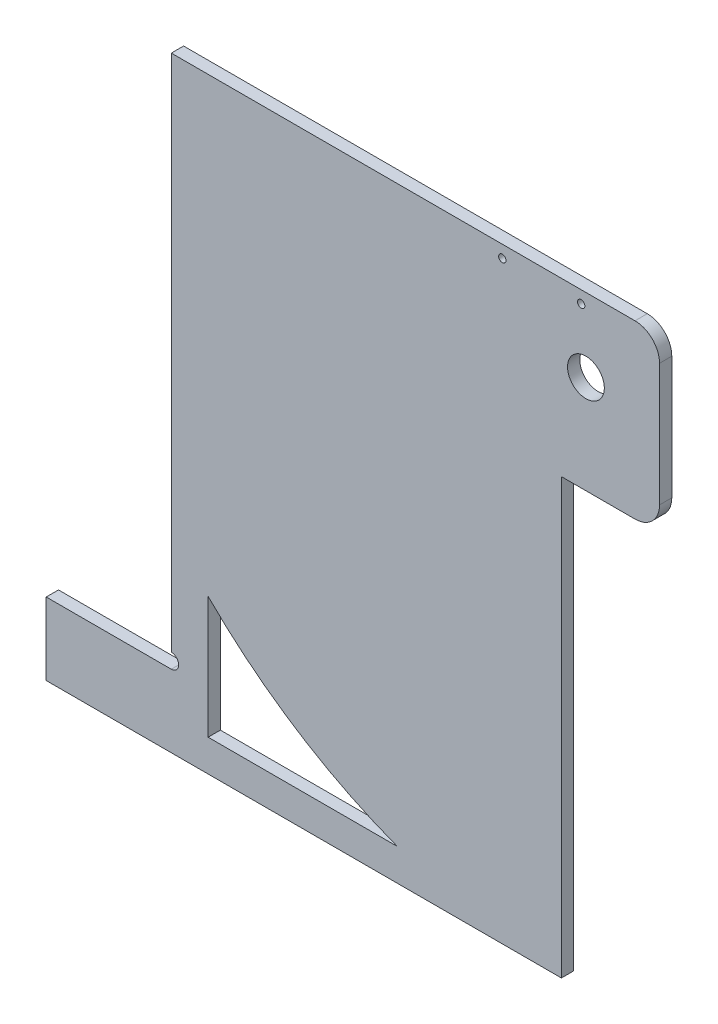
ISO-10303-21;
HEADER;
FILE_DESCRIPTION(('STEP AP214'),'2;1');
FILE_NAME('part.step','',(''),(''),'','','');
FILE_SCHEMA(('AUTOMOTIVE_DESIGN { 1 0 10303 214 1 1 1 1 }'));
ENDSEC;
DATA;
#1=APPLICATION_CONTEXT('core data for automotive mechanical design processes');
#2=APPLICATION_PROTOCOL_DEFINITION('international standard','automotive_design',2000,#1);
#3=PRODUCT_CONTEXT('',#1,'mechanical');
#4=PRODUCT('Part','Part','',(#3));
#5=PRODUCT_RELATED_PRODUCT_CATEGORY('part','',(#4));
#6=PRODUCT_DEFINITION_FORMATION('','',#4);
#7=PRODUCT_DEFINITION_CONTEXT('part definition',#1,'design');
#8=PRODUCT_DEFINITION('design','',#6,#7);
#9=PRODUCT_DEFINITION_SHAPE('','',#8);
#10=(LENGTH_UNIT() NAMED_UNIT(*) SI_UNIT(.MILLI.,.METRE.));
#11=(NAMED_UNIT(*) PLANE_ANGLE_UNIT() SI_UNIT($,.RADIAN.));
#12=(NAMED_UNIT(*) SI_UNIT($,.STERADIAN.) SOLID_ANGLE_UNIT());
#13=UNCERTAINTY_MEASURE_WITH_UNIT(LENGTH_MEASURE(1.E-05),#10,'distance_accuracy_value','');
#14=(GEOMETRIC_REPRESENTATION_CONTEXT(3) GLOBAL_UNCERTAINTY_ASSIGNED_CONTEXT((#13)) GLOBAL_UNIT_ASSIGNED_CONTEXT((#10,
#11,#12)) REPRESENTATION_CONTEXT('',''));
#15=CARTESIAN_POINT('',(0.,0.,0.));
#16=DIRECTION('',(0.,0.,1.));
#17=DIRECTION('',(1.,0.,0.));
#18=AXIS2_PLACEMENT_3D('',#15,#16,#17);
#19=CARTESIAN_POINT('',(10.,-10.,5.));
#20=DIRECTION('',(0.,0.,1.));
#21=DIRECTION('',(1.,0.,0.));
#22=AXIS2_PLACEMENT_3D('',#19,#20,#21);
#23=PLANE('',#22);
#24=DIRECTION('',(0.,1.,0.));
#25=VECTOR('',#24,1.);
#26=CARTESIAN_POINT('',(51.,-217.5,5.));
#27=LINE('',#26,#25);
#28=CARTESIAN_POINT('',(51.,-211.5,5.));
#29=VERTEX_POINT('',#28);
#30=CARTESIAN_POINT('',(51.,0.,5.));
#31=VERTEX_POINT('',#30);
#32=EDGE_CURVE('E213',#29,#31,#27,.T.);
#33=ORIENTED_EDGE('',*,*,#32,.F.);
#34=CARTESIAN_POINT('',(51.,-214.5,5.));
#35=DIRECTION('',(0.,0.,1.));
#36=DIRECTION('',(1.,0.,0.));
#37=AXIS2_PLACEMENT_3D('',#34,#35,#36);
#38=CIRCLE('',#37,3.);
#39=CARTESIAN_POINT('',(51.,-217.5,5.));
#40=VERTEX_POINT('',#39);
#41=EDGE_CURVE('E232',#40,#29,#38,.T.);
#42=ORIENTED_EDGE('',*,*,#41,.F.);
#43=DIRECTION('',(-1.,0.,0.));
#44=VECTOR('',#43,1.);
#45=CARTESIAN_POINT('',(51.,-217.5,5.));
#46=LINE('',#45,#44);
#47=CARTESIAN_POINT('',(0.,-217.5,5.));
#48=VERTEX_POINT('',#47);
#49=EDGE_CURVE('E243',#40,#48,#46,.T.);
#50=ORIENTED_EDGE('',*,*,#49,.T.);
#51=DIRECTION('',(0.,-1.,0.));
#52=VECTOR('',#51,1.);
#53=CARTESIAN_POINT('',(0.,-237.,5.));
#54=LINE('',#53,#52);
#55=CARTESIAN_POINT('',(0.,-247.,5.));
#56=VERTEX_POINT('',#55);
#57=EDGE_CURVE('E257',#48,#56,#54,.T.);
#58=ORIENTED_EDGE('',*,*,#57,.T.);
#59=DIRECTION('',(-1.,0.,0.));
#60=VECTOR('',#59,1.);
#61=CARTESIAN_POINT('',(10.0000000000001,-247.,5.));
#62=LINE('',#61,#60);
#63=CARTESIAN_POINT('',(210.,-247.,5.));
#64=VERTEX_POINT('',#63);
#65=EDGE_CURVE('E254',#64,#56,#62,.T.);
#66=ORIENTED_EDGE('',*,*,#65,.F.);
#67=DIRECTION('',(0.,-1.,0.));
#68=VECTOR('',#67,1.);
#69=CARTESIAN_POINT('',(210.,0.,5.));
#70=LINE('',#69,#68);
#71=CARTESIAN_POINT('',(210.,-70.,5.));
#72=VERTEX_POINT('',#71);
#73=EDGE_CURVE('E262',#72,#64,#70,.T.);
#74=ORIENTED_EDGE('',*,*,#73,.F.);
#75=DIRECTION('',(1.,0.,0.));
#76=VECTOR('',#75,1.);
#77=CARTESIAN_POINT('',(210.,-70.,5.));
#78=LINE('',#77,#76);
#79=CARTESIAN_POINT('',(240.,-70.,5.));
#80=VERTEX_POINT('',#79);
#81=EDGE_CURVE('E287',#72,#80,#78,.T.);
#82=ORIENTED_EDGE('',*,*,#81,.T.);
#83=CARTESIAN_POINT('',(240.,-60.,5.));
#84=DIRECTION('',(0.,0.,1.));
#85=DIRECTION('',(1.,0.,0.));
#86=AXIS2_PLACEMENT_3D('',#83,#84,#85);
#87=CIRCLE('',#86,10.);
#88=CARTESIAN_POINT('',(250.,-60.,5.));
#89=VERTEX_POINT('',#88);
#90=EDGE_CURVE('E285',#80,#89,#87,.T.);
#91=ORIENTED_EDGE('',*,*,#90,.T.);
#92=DIRECTION('',(0.,-1.,0.));
#93=VECTOR('',#92,1.);
#94=CARTESIAN_POINT('',(250.,-10.0000000000001,5.));
#95=LINE('',#94,#93);
#96=CARTESIAN_POINT('',(250.,-10.0000000000001,5.));
#97=VERTEX_POINT('',#96);
#98=EDGE_CURVE('E281',#97,#89,#95,.T.);
#99=ORIENTED_EDGE('',*,*,#98,.F.);
#100=CARTESIAN_POINT('',(240.,-10.,5.));
#101=DIRECTION('',(0.,0.,-1.));
#102=DIRECTION('',(-1.,0.,0.));
#103=AXIS2_PLACEMENT_3D('',#100,#101,#102);
#104=CIRCLE('',#103,10.);
#105=CARTESIAN_POINT('',(240.,0.,5.));
#106=VERTEX_POINT('',#105);
#107=EDGE_CURVE('E278',#106,#97,#104,.T.);
#108=ORIENTED_EDGE('',*,*,#107,.F.);
#109=DIRECTION('',(1.,0.,0.));
#110=VECTOR('',#109,1.);
#111=CARTESIAN_POINT('',(10.0000000000001,0.,5.));
#112=LINE('',#111,#110);
#113=EDGE_CURVE('E260',#31,#106,#112,.T.);
#114=ORIENTED_EDGE('',*,*,#113,.F.);
#115=EDGE_LOOP('',(#33,#42,#50,#58,#66,#74,#82,#91,#99,#108,#114));
#116=FACE_BOUND('',#115,.T.);
#117=CARTESIAN_POINT('',(218.076993273607,-5.00000000000004,5.));
#118=DIRECTION('',(0.,0.,1.));
#119=DIRECTION('',(1.,0.,0.));
#120=AXIS2_PLACEMENT_3D('',#117,#118,#119);
#121=CIRCLE('',#120,1.5);
#122=CARTESIAN_POINT('',(219.576993273607,-5.00000000000004,5.));
#123=VERTEX_POINT('',#122);
#124=EDGE_CURVE('E219',#123,#123,#121,.T.);
#125=ORIENTED_EDGE('',*,*,#124,.F.);
#126=EDGE_LOOP('',(#125));
#127=FACE_BOUND('',#126,.T.);
#128=CARTESIAN_POINT('',(185.921620836921,-5.00000000000004,5.));
#129=DIRECTION('',(0.,0.,1.));
#130=DIRECTION('',(1.,0.,0.));
#131=AXIS2_PLACEMENT_3D('',#128,#129,#130);
#132=CIRCLE('',#131,1.5);
#133=CARTESIAN_POINT('',(187.421620836921,-5.00000000000004,5.));
#134=VERTEX_POINT('',#133);
#135=EDGE_CURVE('E223',#134,#134,#132,.T.);
#136=ORIENTED_EDGE('',*,*,#135,.F.);
#137=EDGE_LOOP('',(#136));
#138=FACE_BOUND('',#137,.T.);
#139=CARTESIAN_POINT('',(220.,-30.,5.));
#140=DIRECTION('',(0.,0.,1.));
#141=DIRECTION('',(1.,0.,0.));
#142=AXIS2_PLACEMENT_3D('',#139,#140,#141);
#143=CIRCLE('',#142,7.50000000000001);
#144=CARTESIAN_POINT('',(227.5,-30.,5.));
#145=VERTEX_POINT('',#144);
#146=EDGE_CURVE('E246',#145,#145,#143,.T.);
#147=ORIENTED_EDGE('',*,*,#146,.F.);
#148=EDGE_LOOP('',(#147));
#149=FACE_BOUND('',#148,.T.);
#150=DIRECTION('',(0.,1.,0.));
#151=VECTOR('',#150,1.);
#152=CARTESIAN_POINT('',(66.,-10.,5.));
#153=LINE('',#152,#151);
#154=CARTESIAN_POINT('',(66.,-234.,5.));
#155=VERTEX_POINT('',#154);
#156=CARTESIAN_POINT('',(66.,-184.298412175887,5.));
#157=VERTEX_POINT('',#156);
#158=EDGE_CURVE('E189',#155,#157,#153,.T.);
#159=ORIENTED_EDGE('',*,*,#158,.T.);
#160=CARTESIAN_POINT('',(220.,-30.,5.));
#161=DIRECTION('',(0.,0.,1.));
#162=DIRECTION('',(1.,0.,0.));
#163=AXIS2_PLACEMENT_3D('',#160,#161,#162);
#164=CIRCLE('',#163,218.);
#165=CARTESIAN_POINT('',(143.136484597697,-234.,5.));
#166=VERTEX_POINT('',#165);
#167=EDGE_CURVE('E208',#157,#166,#164,.T.);
#168=ORIENTED_EDGE('',*,*,#167,.T.);
#169=DIRECTION('',(-1.,0.,0.));
#170=VECTOR('',#169,1.);
#171=CARTESIAN_POINT('',(10.,-234.,5.));
#172=LINE('',#171,#170);
#173=EDGE_CURVE('E204',#166,#155,#172,.T.);
#174=ORIENTED_EDGE('',*,*,#173,.T.);
#175=EDGE_LOOP('',(#159,#168,#174));
#176=FACE_BOUND('',#175,.T.);
#177=ADVANCED_FACE('F82',(#116,#127,#138,#149,#176),#23,.T.);
#178=CARTESIAN_POINT('',(10.,-10.,0.));
#179=DIRECTION('',(0.,0.,1.));
#180=DIRECTION('',(1.,0.,0.));
#181=AXIS2_PLACEMENT_3D('',#178,#179,#180);
#182=PLANE('',#181);
#183=CARTESIAN_POINT('',(220.,-30.,0.));
#184=DIRECTION('',(0.,0.,1.));
#185=DIRECTION('',(1.,0.,0.));
#186=AXIS2_PLACEMENT_3D('',#183,#184,#185);
#187=CIRCLE('',#186,7.50000000000001);
#188=CARTESIAN_POINT('',(227.5,-30.,0.));
#189=VERTEX_POINT('',#188);
#190=EDGE_CURVE('E248',#189,#189,#187,.T.);
#191=ORIENTED_EDGE('',*,*,#190,.T.);
#192=EDGE_LOOP('',(#191));
#193=FACE_BOUND('',#192,.T.);
#194=CARTESIAN_POINT('',(51.,-214.5,0.));
#195=DIRECTION('',(0.,0.,1.));
#196=DIRECTION('',(1.,0.,0.));
#197=AXIS2_PLACEMENT_3D('',#194,#195,#196);
#198=CIRCLE('',#197,3.);
#199=CARTESIAN_POINT('',(51.,-211.5,0.));
#200=VERTEX_POINT('',#199);
#201=CARTESIAN_POINT('',(51.,-217.5,0.));
#202=VERTEX_POINT('',#201);
#203=EDGE_CURVE('E226',#200,#202,#198,.F.);
#204=ORIENTED_EDGE('',*,*,#203,.F.);
#205=DIRECTION('',(0.,-1.,0.));
#206=VECTOR('',#205,1.);
#207=CARTESIAN_POINT('',(51.,-217.5,0.));
#208=LINE('',#207,#206);
#209=CARTESIAN_POINT('',(51.,0.,0.));
#210=VERTEX_POINT('',#209);
#211=EDGE_CURVE('E211',#210,#200,#208,.T.);
#212=ORIENTED_EDGE('',*,*,#211,.F.);
#213=DIRECTION('',(1.,0.,0.));
#214=VECTOR('',#213,1.);
#215=CARTESIAN_POINT('',(10.0000000000001,0.,0.));
#216=LINE('',#215,#214);
#217=CARTESIAN_POINT('',(240.,0.,0.));
#218=VERTEX_POINT('',#217);
#219=EDGE_CURVE('E267',#210,#218,#216,.T.);
#220=ORIENTED_EDGE('',*,*,#219,.T.);
#221=CARTESIAN_POINT('',(240.,-10.,0.));
#222=DIRECTION('',(0.,0.,-1.));
#223=DIRECTION('',(-1.,0.,0.));
#224=AXIS2_PLACEMENT_3D('',#221,#222,#223);
#225=CIRCLE('',#224,10.);
#226=CARTESIAN_POINT('',(250.,-10.0000000000001,0.));
#227=VERTEX_POINT('',#226);
#228=EDGE_CURVE('E251',#218,#227,#225,.T.);
#229=ORIENTED_EDGE('',*,*,#228,.T.);
#230=DIRECTION('',(0.,-1.,0.));
#231=VECTOR('',#230,1.);
#232=CARTESIAN_POINT('',(250.,-10.0000000000001,0.));
#233=LINE('',#232,#231);
#234=CARTESIAN_POINT('',(250.,-60.,0.));
#235=VERTEX_POINT('',#234);
#236=EDGE_CURVE('E291',#227,#235,#233,.T.);
#237=ORIENTED_EDGE('',*,*,#236,.T.);
#238=CARTESIAN_POINT('',(240.,-60.,0.));
#239=DIRECTION('',(0.,0.,1.));
#240=DIRECTION('',(1.,0.,0.));
#241=AXIS2_PLACEMENT_3D('',#238,#239,#240);
#242=CIRCLE('',#241,10.);
#243=CARTESIAN_POINT('',(240.,-70.,0.));
#244=VERTEX_POINT('',#243);
#245=EDGE_CURVE('E294',#244,#235,#242,.T.);
#246=ORIENTED_EDGE('',*,*,#245,.F.);
#247=DIRECTION('',(1.,0.,0.));
#248=VECTOR('',#247,1.);
#249=CARTESIAN_POINT('',(210.,-70.,0.));
#250=LINE('',#249,#248);
#251=CARTESIAN_POINT('',(210.,-70.,0.));
#252=VERTEX_POINT('',#251);
#253=EDGE_CURVE('E282',#252,#244,#250,.T.);
#254=ORIENTED_EDGE('',*,*,#253,.F.);
#255=DIRECTION('',(0.,-1.,0.));
#256=VECTOR('',#255,1.);
#257=CARTESIAN_POINT('',(210.,-237.,0.));
#258=LINE('',#257,#256);
#259=CARTESIAN_POINT('',(210.,-247.,0.));
#260=VERTEX_POINT('',#259);
#261=EDGE_CURVE('E270',#252,#260,#258,.T.);
#262=ORIENTED_EDGE('',*,*,#261,.T.);
#263=DIRECTION('',(1.,0.,0.));
#264=VECTOR('',#263,1.);
#265=CARTESIAN_POINT('',(10.0000000000001,-247.,0.));
#266=LINE('',#265,#264);
#267=CARTESIAN_POINT('',(0.,-247.,0.));
#268=VERTEX_POINT('',#267);
#269=EDGE_CURVE('E258',#268,#260,#266,.T.);
#270=ORIENTED_EDGE('',*,*,#269,.F.);
#271=DIRECTION('',(0.,-1.,0.));
#272=VECTOR('',#271,1.);
#273=CARTESIAN_POINT('',(0.,-10.0000000000001,0.));
#274=LINE('',#273,#272);
#275=CARTESIAN_POINT('',(0.,-217.5,0.));
#276=VERTEX_POINT('',#275);
#277=EDGE_CURVE('E265',#276,#268,#274,.T.);
#278=ORIENTED_EDGE('',*,*,#277,.F.);
#279=DIRECTION('',(-1.,0.,0.));
#280=VECTOR('',#279,1.);
#281=CARTESIAN_POINT('',(51.,-217.5,0.));
#282=LINE('',#281,#280);
#283=EDGE_CURVE('E241',#202,#276,#282,.T.);
#284=ORIENTED_EDGE('',*,*,#283,.F.);
#285=EDGE_LOOP('',(#204,#212,#220,#229,#237,#246,#254,#262,#270,#278,#284));
#286=FACE_BOUND('',#285,.T.);
#287=CARTESIAN_POINT('',(185.921620836921,-5.00000000000004,0.));
#288=DIRECTION('',(0.,0.,1.));
#289=DIRECTION('',(1.,0.,0.));
#290=AXIS2_PLACEMENT_3D('',#287,#288,#289);
#291=CIRCLE('',#290,1.5);
#292=CARTESIAN_POINT('',(187.421620836921,-5.00000000000004,0.));
#293=VERTEX_POINT('',#292);
#294=EDGE_CURVE('E218',#293,#293,#291,.F.);
#295=ORIENTED_EDGE('',*,*,#294,.F.);
#296=EDGE_LOOP('',(#295));
#297=FACE_BOUND('',#296,.T.);
#298=CARTESIAN_POINT('',(218.076993273607,-5.00000000000004,0.));
#299=DIRECTION('',(0.,0.,1.));
#300=DIRECTION('',(1.,0.,0.));
#301=AXIS2_PLACEMENT_3D('',#298,#299,#300);
#302=CIRCLE('',#301,1.5);
#303=CARTESIAN_POINT('',(219.576993273607,-5.00000000000004,0.));
#304=VERTEX_POINT('',#303);
#305=EDGE_CURVE('E222',#304,#304,#302,.F.);
#306=ORIENTED_EDGE('',*,*,#305,.F.);
#307=EDGE_LOOP('',(#306));
#308=FACE_BOUND('',#307,.T.);
#309=CARTESIAN_POINT('',(220.,-30.,0.));
#310=DIRECTION('',(0.,0.,-1.));
#311=DIRECTION('',(-1.,0.,0.));
#312=AXIS2_PLACEMENT_3D('',#309,#310,#311);
#313=CIRCLE('',#312,218.);
#314=CARTESIAN_POINT('',(143.136484597697,-234.,0.));
#315=VERTEX_POINT('',#314);
#316=CARTESIAN_POINT('',(66.,-184.298412175887,0.));
#317=VERTEX_POINT('',#316);
#318=EDGE_CURVE('E107',#315,#317,#313,.T.);
#319=ORIENTED_EDGE('',*,*,#318,.T.);
#320=DIRECTION('',(0.,-1.,0.));
#321=VECTOR('',#320,1.);
#322=CARTESIAN_POINT('',(66.,0.,0.));
#323=LINE('',#322,#321);
#324=CARTESIAN_POINT('',(66.,-234.,0.));
#325=VERTEX_POINT('',#324);
#326=EDGE_CURVE('E187',#317,#325,#323,.T.);
#327=ORIENTED_EDGE('',*,*,#326,.T.);
#328=DIRECTION('',(1.,0.,0.));
#329=VECTOR('',#328,1.);
#330=CARTESIAN_POINT('',(0.,-234.,0.));
#331=LINE('',#330,#329);
#332=EDGE_CURVE('E195',#325,#315,#331,.T.);
#333=ORIENTED_EDGE('',*,*,#332,.T.);
#334=EDGE_LOOP('',(#319,#327,#333));
#335=FACE_BOUND('',#334,.T.);
#336=ADVANCED_FACE('F199',(#193,#286,#297,#308,#335),#182,.F.);
#337=CARTESIAN_POINT('',(0.,-10.0000000000001,5.));
#338=DIRECTION('',(1.,0.,0.));
#339=DIRECTION('',(0.,0.,-1.));
#340=AXIS2_PLACEMENT_3D('',#337,#338,#339);
#341=PLANE('',#340);
#342=ORIENTED_EDGE('',*,*,#57,.F.);
#343=DIRECTION('',(0.,0.,1.));
#344=VECTOR('',#343,1.);
#345=CARTESIAN_POINT('',(0.,-217.5,0.));
#346=LINE('',#345,#344);
#347=EDGE_CURVE('E235',#276,#48,#346,.T.);
#348=ORIENTED_EDGE('',*,*,#347,.F.);
#349=ORIENTED_EDGE('',*,*,#277,.T.);
#350=DIRECTION('',(0.,0.,-1.));
#351=VECTOR('',#350,1.);
#352=CARTESIAN_POINT('',(0.,-247.,5.));
#353=LINE('',#352,#351);
#354=EDGE_CURVE('E264',#56,#268,#353,.T.);
#355=ORIENTED_EDGE('',*,*,#354,.F.);
#356=EDGE_LOOP('',(#342,#348,#349,#355));
#357=FACE_BOUND('',#356,.T.);
#358=ADVANCED_FACE('F334',(#357),#341,.F.);
#359=CARTESIAN_POINT('',(10.0000000000001,-247.,5.));
#360=DIRECTION('',(0.,1.,0.));
#361=DIRECTION('',(0.,0.,1.));
#362=AXIS2_PLACEMENT_3D('',#359,#360,#361);
#363=PLANE('',#362);
#364=ORIENTED_EDGE('',*,*,#269,.T.);
#365=DIRECTION('',(0.,0.,-1.));
#366=VECTOR('',#365,1.);
#367=CARTESIAN_POINT('',(210.,-247.,5.));
#368=LINE('',#367,#366);
#369=EDGE_CURVE('E91',#64,#260,#368,.T.);
#370=ORIENTED_EDGE('',*,*,#369,.F.);
#371=ORIENTED_EDGE('',*,*,#65,.T.);
#372=ORIENTED_EDGE('',*,*,#354,.T.);
#373=EDGE_LOOP('',(#364,#370,#371,#372));
#374=FACE_BOUND('',#373,.T.);
#375=ADVANCED_FACE('F341',(#374),#363,.F.);
#376=CARTESIAN_POINT('',(210.,-237.,5.));
#377=DIRECTION('',(1.,0.,0.));
#378=DIRECTION('',(0.,0.,-1.));
#379=AXIS2_PLACEMENT_3D('',#376,#377,#378);
#380=PLANE('',#379);
#381=DIRECTION('',(0.,0.,-1.));
#382=VECTOR('',#381,1.);
#383=CARTESIAN_POINT('',(210.,-70.,5.));
#384=LINE('',#383,#382);
#385=EDGE_CURVE('E12',#72,#252,#384,.T.);
#386=ORIENTED_EDGE('',*,*,#385,.F.);
#387=ORIENTED_EDGE('',*,*,#73,.T.);
#388=ORIENTED_EDGE('',*,*,#369,.T.);
#389=ORIENTED_EDGE('',*,*,#261,.F.);
#390=EDGE_LOOP('',(#386,#387,#388,#389));
#391=FACE_BOUND('',#390,.T.);
#392=ADVANCED_FACE('F347',(#391),#380,.T.);
#393=CARTESIAN_POINT('',(10.0000000000001,0.,5.));
#394=DIRECTION('',(0.,1.,0.));
#395=DIRECTION('',(0.,0.,1.));
#396=AXIS2_PLACEMENT_3D('',#393,#394,#395);
#397=PLANE('',#396);
#398=DIRECTION('',(0.,0.,1.));
#399=VECTOR('',#398,1.);
#400=CARTESIAN_POINT('',(51.,0.,-0.00100000000000013));
#401=LINE('',#400,#399);
#402=EDGE_CURVE('E215',#210,#31,#401,.T.);
#403=ORIENTED_EDGE('',*,*,#402,.T.);
#404=ORIENTED_EDGE('',*,*,#113,.T.);
#405=DIRECTION('',(0.,0.,-1.));
#406=VECTOR('',#405,1.);
#407=CARTESIAN_POINT('',(240.,0.,5.));
#408=LINE('',#407,#406);
#409=EDGE_CURVE('E86',#106,#218,#408,.T.);
#410=ORIENTED_EDGE('',*,*,#409,.T.);
#411=ORIENTED_EDGE('',*,*,#219,.F.);
#412=EDGE_LOOP('',(#403,#404,#410,#411));
#413=FACE_BOUND('',#412,.T.);
#414=ADVANCED_FACE('F309',(#413),#397,.T.);
#415=CARTESIAN_POINT('',(240.,-10.,5.));
#416=DIRECTION('',(0.,0.,-1.));
#417=DIRECTION('',(-1.,0.,0.));
#418=AXIS2_PLACEMENT_3D('',#415,#416,#417);
#419=CYLINDRICAL_SURFACE('',#418,10.);
#420=ORIENTED_EDGE('',*,*,#228,.F.);
#421=ORIENTED_EDGE('',*,*,#409,.F.);
#422=ORIENTED_EDGE('',*,*,#107,.T.);
#423=DIRECTION('',(0.,0.,-1.));
#424=VECTOR('',#423,1.);
#425=CARTESIAN_POINT('',(250.,-10.0000000000001,5.));
#426=LINE('',#425,#424);
#427=EDGE_CURVE('E301',#97,#227,#426,.T.);
#428=ORIENTED_EDGE('',*,*,#427,.T.);
#429=EDGE_LOOP('',(#420,#421,#422,#428));
#430=FACE_BOUND('',#429,.T.);
#431=ADVANCED_FACE('F84',(#430),#419,.T.);
#432=CARTESIAN_POINT('',(250.,-10.0000000000001,5.));
#433=DIRECTION('',(1.,0.,0.));
#434=DIRECTION('',(0.,0.,-1.));
#435=AXIS2_PLACEMENT_3D('',#432,#433,#434);
#436=PLANE('',#435);
#437=ORIENTED_EDGE('',*,*,#236,.F.);
#438=ORIENTED_EDGE('',*,*,#427,.F.);
#439=ORIENTED_EDGE('',*,*,#98,.T.);
#440=DIRECTION('',(0.,0.,-1.));
#441=VECTOR('',#440,1.);
#442=CARTESIAN_POINT('',(250.,-60.,5.));
#443=LINE('',#442,#441);
#444=EDGE_CURVE('E300',#89,#235,#443,.T.);
#445=ORIENTED_EDGE('',*,*,#444,.T.);
#446=EDGE_LOOP('',(#437,#438,#439,#445));
#447=FACE_BOUND('',#446,.T.);
#448=ADVANCED_FACE('F356',(#447),#436,.T.);
#449=CARTESIAN_POINT('',(240.,-60.,5.));
#450=DIRECTION('',(0.,0.,-1.));
#451=DIRECTION('',(-1.,0.,0.));
#452=AXIS2_PLACEMENT_3D('',#449,#450,#451);
#453=CYLINDRICAL_SURFACE('',#452,10.);
#454=ORIENTED_EDGE('',*,*,#245,.T.);
#455=ORIENTED_EDGE('',*,*,#444,.F.);
#456=ORIENTED_EDGE('',*,*,#90,.F.);
#457=DIRECTION('',(0.,0.,-1.));
#458=VECTOR('',#457,1.);
#459=CARTESIAN_POINT('',(240.,-70.,5.));
#460=LINE('',#459,#458);
#461=EDGE_CURVE('E268',#80,#244,#460,.T.);
#462=ORIENTED_EDGE('',*,*,#461,.T.);
#463=EDGE_LOOP('',(#454,#455,#456,#462));
#464=FACE_BOUND('',#463,.T.);
#465=ADVANCED_FACE('F353',(#464),#453,.T.);
#466=CARTESIAN_POINT('',(210.,-70.,5.));
#467=DIRECTION('',(0.,1.,0.));
#468=DIRECTION('',(0.,0.,1.));
#469=AXIS2_PLACEMENT_3D('',#466,#467,#468);
#470=PLANE('',#469);
#471=ORIENTED_EDGE('',*,*,#253,.T.);
#472=ORIENTED_EDGE('',*,*,#461,.F.);
#473=ORIENTED_EDGE('',*,*,#81,.F.);
#474=ORIENTED_EDGE('',*,*,#385,.T.);
#475=EDGE_LOOP('',(#471,#472,#473,#474));
#476=FACE_BOUND('',#475,.T.);
#477=ADVANCED_FACE('F349',(#476),#470,.F.);
#478=CARTESIAN_POINT('',(220.,-30.,0.));
#479=DIRECTION('',(0.,0.,1.));
#480=DIRECTION('',(1.,0.,0.));
#481=AXIS2_PLACEMENT_3D('',#478,#479,#480);
#482=CYLINDRICAL_SURFACE('',#481,7.50000000000001);
#483=ORIENTED_EDGE('',*,*,#190,.F.);
#484=EDGE_LOOP('',(#483));
#485=FACE_BOUND('',#484,.T.);
#486=ORIENTED_EDGE('',*,*,#146,.T.);
#487=EDGE_LOOP('',(#486));
#488=FACE_BOUND('',#487,.T.);
#489=ADVANCED_FACE('F371',(#485,#488),#482,.F.);
#490=CARTESIAN_POINT('',(51.,-217.5,0.));
#491=DIRECTION('',(0.,-1.,0.));
#492=DIRECTION('',(0.,0.,-1.));
#493=AXIS2_PLACEMENT_3D('',#490,#491,#492);
#494=PLANE('',#493);
#495=ORIENTED_EDGE('',*,*,#347,.T.);
#496=ORIENTED_EDGE('',*,*,#49,.F.);
#497=DIRECTION('',(0.,0.,1.));
#498=VECTOR('',#497,1.);
#499=CARTESIAN_POINT('',(51.,-217.5,0.));
#500=LINE('',#499,#498);
#501=EDGE_CURVE('E239',#202,#40,#500,.T.);
#502=ORIENTED_EDGE('',*,*,#501,.F.);
#503=ORIENTED_EDGE('',*,*,#283,.T.);
#504=EDGE_LOOP('',(#495,#496,#502,#503));
#505=FACE_BOUND('',#504,.T.);
#506=ADVANCED_FACE('F330',(#505),#494,.F.);
#507=CARTESIAN_POINT('',(51.,-214.5,-0.00100000000000013));
#508=DIRECTION('',(0.,0.,1.));
#509=DIRECTION('',(1.,0.,0.));
#510=AXIS2_PLACEMENT_3D('',#507,#508,#509);
#511=CYLINDRICAL_SURFACE('',#510,3.);
#512=ORIENTED_EDGE('',*,*,#203,.T.);
#513=ORIENTED_EDGE('',*,*,#501,.T.);
#514=ORIENTED_EDGE('',*,*,#41,.T.);
#515=DIRECTION('',(0.,0.,-1.));
#516=VECTOR('',#515,1.);
#517=CARTESIAN_POINT('',(51.,-211.5,0.));
#518=LINE('',#517,#516);
#519=EDGE_CURVE('E236',#29,#200,#518,.T.);
#520=ORIENTED_EDGE('',*,*,#519,.T.);
#521=EDGE_LOOP('',(#512,#513,#514,#520));
#522=FACE_BOUND('',#521,.T.);
#523=ADVANCED_FACE('F322',(#522),#511,.F.);
#524=CARTESIAN_POINT('',(185.921620836921,-5.00000000000004,-0.00100000000000013));
#525=DIRECTION('',(0.,0.,1.));
#526=DIRECTION('',(1.,0.,0.));
#527=AXIS2_PLACEMENT_3D('',#524,#525,#526);
#528=CYLINDRICAL_SURFACE('',#527,1.5);
#529=ORIENTED_EDGE('',*,*,#135,.T.);
#530=EDGE_LOOP('',(#529));
#531=FACE_BOUND('',#530,.T.);
#532=ORIENTED_EDGE('',*,*,#294,.T.);
#533=EDGE_LOOP('',(#532));
#534=FACE_BOUND('',#533,.T.);
#535=ADVANCED_FACE('F409',(#531,#534),#528,.F.);
#536=CARTESIAN_POINT('',(218.076993273607,-5.00000000000004,-0.00100000000000013));
#537=DIRECTION('',(0.,0.,1.));
#538=DIRECTION('',(1.,0.,0.));
#539=AXIS2_PLACEMENT_3D('',#536,#537,#538);
#540=CYLINDRICAL_SURFACE('',#539,1.5);
#541=ORIENTED_EDGE('',*,*,#124,.T.);
#542=EDGE_LOOP('',(#541));
#543=FACE_BOUND('',#542,.T.);
#544=ORIENTED_EDGE('',*,*,#305,.T.);
#545=EDGE_LOOP('',(#544));
#546=FACE_BOUND('',#545,.T.);
#547=ADVANCED_FACE('F403',(#543,#546),#540,.F.);
#548=CARTESIAN_POINT('',(51.,-217.5,-0.00100000000000013));
#549=DIRECTION('',(1.,0.,0.));
#550=DIRECTION('',(0.,0.,-1.));
#551=AXIS2_PLACEMENT_3D('',#548,#549,#550);
#552=PLANE('',#551);
#553=ORIENTED_EDGE('',*,*,#211,.T.);
#554=ORIENTED_EDGE('',*,*,#519,.F.);
#555=ORIENTED_EDGE('',*,*,#32,.T.);
#556=ORIENTED_EDGE('',*,*,#402,.F.);
#557=EDGE_LOOP('',(#553,#554,#555,#556));
#558=FACE_BOUND('',#557,.T.);
#559=ADVANCED_FACE('F319',(#558),#552,.F.);
#560=CARTESIAN_POINT('',(220.,-30.,10.));
#561=DIRECTION('',(0.,0.,-1.));
#562=DIRECTION('',(-1.,0.,0.));
#563=AXIS2_PLACEMENT_3D('',#560,#561,#562);
#564=CYLINDRICAL_SURFACE('',#563,218.);
#565=DIRECTION('',(0.,0.,-1.));
#566=VECTOR('',#565,1.);
#567=CARTESIAN_POINT('',(66.,-184.298412175887,10.));
#568=LINE('',#567,#566);
#569=EDGE_CURVE('E191',#157,#317,#568,.T.);
#570=ORIENTED_EDGE('',*,*,#569,.T.);
#571=ORIENTED_EDGE('',*,*,#318,.F.);
#572=DIRECTION('',(0.,0.,-1.));
#573=VECTOR('',#572,1.);
#574=CARTESIAN_POINT('',(143.136484597697,-234.,10.));
#575=LINE('',#574,#573);
#576=EDGE_CURVE('E192',#166,#315,#575,.T.);
#577=ORIENTED_EDGE('',*,*,#576,.F.);
#578=ORIENTED_EDGE('',*,*,#167,.F.);
#579=EDGE_LOOP('',(#570,#571,#577,#578));
#580=FACE_BOUND('',#579,.T.);
#581=ADVANCED_FACE('F395',(#580),#564,.T.);
#582=CARTESIAN_POINT('',(66.,0.,10.));
#583=DIRECTION('',(1.,0.,0.));
#584=DIRECTION('',(0.,0.,-1.));
#585=AXIS2_PLACEMENT_3D('',#582,#583,#584);
#586=PLANE('',#585);
#587=DIRECTION('',(0.,0.,-1.));
#588=VECTOR('',#587,1.);
#589=CARTESIAN_POINT('',(66.,-234.,10.));
#590=LINE('',#589,#588);
#591=EDGE_CURVE('E99',#155,#325,#590,.T.);
#592=ORIENTED_EDGE('',*,*,#591,.T.);
#593=ORIENTED_EDGE('',*,*,#326,.F.);
#594=ORIENTED_EDGE('',*,*,#569,.F.);
#595=ORIENTED_EDGE('',*,*,#158,.F.);
#596=EDGE_LOOP('',(#592,#593,#594,#595));
#597=FACE_BOUND('',#596,.T.);
#598=ADVANCED_FACE('F184',(#597),#586,.T.);
#599=CARTESIAN_POINT('',(0.,-234.,10.));
#600=DIRECTION('',(0.,1.,0.));
#601=DIRECTION('',(0.,0.,1.));
#602=AXIS2_PLACEMENT_3D('',#599,#600,#601);
#603=PLANE('',#602);
#604=ORIENTED_EDGE('',*,*,#576,.T.);
#605=ORIENTED_EDGE('',*,*,#332,.F.);
#606=ORIENTED_EDGE('',*,*,#591,.F.);
#607=ORIENTED_EDGE('',*,*,#173,.F.);
#608=EDGE_LOOP('',(#604,#605,#606,#607));
#609=FACE_BOUND('',#608,.T.);
#610=ADVANCED_FACE('F196',(#609),#603,.T.);
#611=CLOSED_SHELL('',(#177,#336,#358,#375,#392,#414,#431,#448,#465,#477,#489,#506,#523,#535,
#547,#559,#581,#598,#610));
#612=MANIFOLD_SOLID_BREP('B2',#611);
#613=ADVANCED_BREP_SHAPE_REPRESENTATION('',(#18,#612),#14);
#614=SHAPE_DEFINITION_REPRESENTATION(#9,#613);
ENDSEC;
END-ISO-10303-21;
